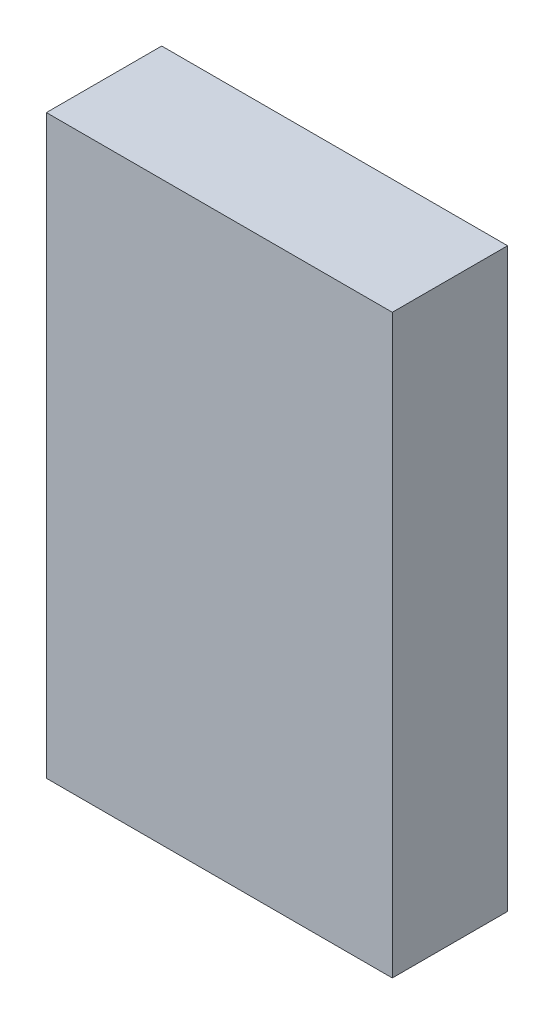
ISO-10303-21;
HEADER;
FILE_DESCRIPTION(('STEP AP214'),'2;1');
FILE_NAME('part.step','',(''),(''),'','','');
FILE_SCHEMA(('AUTOMOTIVE_DESIGN { 1 0 10303 214 1 1 1 1 }'));
ENDSEC;
DATA;
#1=APPLICATION_CONTEXT('core data for automotive mechanical design processes');
#2=APPLICATION_PROTOCOL_DEFINITION('international standard','automotive_design',2000,#1);
#3=PRODUCT_CONTEXT('',#1,'mechanical');
#4=PRODUCT('Part','Part','',(#3));
#5=PRODUCT_RELATED_PRODUCT_CATEGORY('part','',(#4));
#6=PRODUCT_DEFINITION_FORMATION('','',#4);
#7=PRODUCT_DEFINITION_CONTEXT('part definition',#1,'design');
#8=PRODUCT_DEFINITION('design','',#6,#7);
#9=PRODUCT_DEFINITION_SHAPE('','',#8);
#10=(LENGTH_UNIT() NAMED_UNIT(*) SI_UNIT(.MILLI.,.METRE.));
#11=(NAMED_UNIT(*) PLANE_ANGLE_UNIT() SI_UNIT($,.RADIAN.));
#12=(NAMED_UNIT(*) SI_UNIT($,.STERADIAN.) SOLID_ANGLE_UNIT());
#13=UNCERTAINTY_MEASURE_WITH_UNIT(LENGTH_MEASURE(1.E-05),#10,'distance_accuracy_value','');
#14=(GEOMETRIC_REPRESENTATION_CONTEXT(3) GLOBAL_UNCERTAINTY_ASSIGNED_CONTEXT((#13)) GLOBAL_UNIT_ASSIGNED_CONTEXT((#10,
#11,#12)) REPRESENTATION_CONTEXT('',''));
#15=CARTESIAN_POINT('',(0.,0.,0.));
#16=DIRECTION('',(0.,0.,1.));
#17=DIRECTION('',(1.,0.,0.));
#18=AXIS2_PLACEMENT_3D('',#15,#16,#17);
#19=CARTESIAN_POINT('',(1.5,-2.5,1.));
#20=DIRECTION('',(-1.,0.,0.));
#21=DIRECTION('',(0.,0.,1.));
#22=AXIS2_PLACEMENT_3D('',#19,#20,#21);
#23=PLANE('',#22);
#24=DIRECTION('',(0.,1.,0.));
#25=VECTOR('',#24,1.);
#26=CARTESIAN_POINT('',(1.5,-2.5,0.));
#27=LINE('',#26,#25);
#28=CARTESIAN_POINT('',(1.5,-2.5,0.));
#29=VERTEX_POINT('',#28);
#30=CARTESIAN_POINT('',(1.5,2.5,0.));
#31=VERTEX_POINT('',#30);
#32=EDGE_CURVE('E98',#29,#31,#27,.T.);
#33=ORIENTED_EDGE('',*,*,#32,.T.);
#34=DIRECTION('',(0.,0.,-1.));
#35=VECTOR('',#34,1.);
#36=CARTESIAN_POINT('',(1.5,2.5,1.));
#37=LINE('',#36,#35);
#38=CARTESIAN_POINT('',(1.5,2.5,1.));
#39=VERTEX_POINT('',#38);
#40=EDGE_CURVE('E11',#39,#31,#37,.T.);
#41=ORIENTED_EDGE('',*,*,#40,.F.);
#42=DIRECTION('',(0.,1.,0.));
#43=VECTOR('',#42,1.);
#44=CARTESIAN_POINT('',(1.5,-2.5,1.));
#45=LINE('',#44,#43);
#46=CARTESIAN_POINT('',(1.5,-2.5,1.));
#47=VERTEX_POINT('',#46);
#48=EDGE_CURVE('E86',#47,#39,#45,.T.);
#49=ORIENTED_EDGE('',*,*,#48,.F.);
#50=DIRECTION('',(0.,0.,-1.));
#51=VECTOR('',#50,1.);
#52=CARTESIAN_POINT('',(1.5,-2.5,1.));
#53=LINE('',#52,#51);
#54=EDGE_CURVE('E94',#47,#29,#53,.T.);
#55=ORIENTED_EDGE('',*,*,#54,.T.);
#56=EDGE_LOOP('',(#33,#41,#49,#55));
#57=FACE_BOUND('',#56,.T.);
#58=ADVANCED_FACE('F35',(#57),#23,.F.);
#59=CARTESIAN_POINT('',(-1.5,2.5,1.));
#60=DIRECTION('',(0.,-1.,0.));
#61=DIRECTION('',(0.,0.,-1.));
#62=AXIS2_PLACEMENT_3D('',#59,#60,#61);
#63=PLANE('',#62);
#64=DIRECTION('',(-1.,0.,0.));
#65=VECTOR('',#64,1.);
#66=CARTESIAN_POINT('',(-1.5,2.5,0.));
#67=LINE('',#66,#65);
#68=CARTESIAN_POINT('',(-1.5,2.5,0.));
#69=VERTEX_POINT('',#68);
#70=EDGE_CURVE('E90',#31,#69,#67,.T.);
#71=ORIENTED_EDGE('',*,*,#70,.T.);
#72=DIRECTION('',(0.,0.,-1.));
#73=VECTOR('',#72,1.);
#74=CARTESIAN_POINT('',(-1.5,2.5,1.));
#75=LINE('',#74,#73);
#76=CARTESIAN_POINT('',(-1.5,2.5,1.));
#77=VERTEX_POINT('',#76);
#78=EDGE_CURVE('E43',#77,#69,#75,.T.);
#79=ORIENTED_EDGE('',*,*,#78,.F.);
#80=DIRECTION('',(-1.,0.,0.));
#81=VECTOR('',#80,1.);
#82=CARTESIAN_POINT('',(-1.5,2.5,1.));
#83=LINE('',#82,#81);
#84=EDGE_CURVE('E81',#39,#77,#83,.T.);
#85=ORIENTED_EDGE('',*,*,#84,.F.);
#86=ORIENTED_EDGE('',*,*,#40,.T.);
#87=EDGE_LOOP('',(#71,#79,#85,#86));
#88=FACE_BOUND('',#87,.T.);
#89=ADVANCED_FACE('F89',(#88),#63,.F.);
#90=CARTESIAN_POINT('',(-1.5,-2.5,1.));
#91=DIRECTION('',(1.,0.,0.));
#92=DIRECTION('',(0.,0.,-1.));
#93=AXIS2_PLACEMENT_3D('',#90,#91,#92);
#94=PLANE('',#93);
#95=DIRECTION('',(0.,-1.,0.));
#96=VECTOR('',#95,1.);
#97=CARTESIAN_POINT('',(-1.5,-2.5,0.));
#98=LINE('',#97,#96);
#99=CARTESIAN_POINT('',(-1.5,-2.5,0.));
#100=VERTEX_POINT('',#99);
#101=EDGE_CURVE('E68',#69,#100,#98,.T.);
#102=ORIENTED_EDGE('',*,*,#101,.T.);
#103=DIRECTION('',(0.,0.,-1.));
#104=VECTOR('',#103,1.);
#105=CARTESIAN_POINT('',(-1.5,-2.5,1.));
#106=LINE('',#105,#104);
#107=CARTESIAN_POINT('',(-1.5,-2.5,1.));
#108=VERTEX_POINT('',#107);
#109=EDGE_CURVE('E91',#108,#100,#106,.T.);
#110=ORIENTED_EDGE('',*,*,#109,.F.);
#111=DIRECTION('',(0.,-1.,0.));
#112=VECTOR('',#111,1.);
#113=CARTESIAN_POINT('',(-1.5,-2.5,1.));
#114=LINE('',#113,#112);
#115=EDGE_CURVE('E84',#77,#108,#114,.T.);
#116=ORIENTED_EDGE('',*,*,#115,.F.);
#117=ORIENTED_EDGE('',*,*,#78,.T.);
#118=EDGE_LOOP('',(#102,#110,#116,#117));
#119=FACE_BOUND('',#118,.T.);
#120=ADVANCED_FACE('F92',(#119),#94,.F.);
#121=CARTESIAN_POINT('',(-1.5,-2.5,1.));
#122=DIRECTION('',(0.,1.,0.));
#123=DIRECTION('',(0.,0.,1.));
#124=AXIS2_PLACEMENT_3D('',#121,#122,#123);
#125=PLANE('',#124);
#126=DIRECTION('',(1.,0.,0.));
#127=VECTOR('',#126,1.);
#128=CARTESIAN_POINT('',(-1.5,-2.5,0.));
#129=LINE('',#128,#127);
#130=EDGE_CURVE('E74',#100,#29,#129,.T.);
#131=ORIENTED_EDGE('',*,*,#130,.T.);
#132=ORIENTED_EDGE('',*,*,#54,.F.);
#133=DIRECTION('',(1.,0.,0.));
#134=VECTOR('',#133,1.);
#135=CARTESIAN_POINT('',(-1.5,-2.5,1.));
#136=LINE('',#135,#134);
#137=EDGE_CURVE('E51',#108,#47,#136,.T.);
#138=ORIENTED_EDGE('',*,*,#137,.F.);
#139=ORIENTED_EDGE('',*,*,#109,.T.);
#140=EDGE_LOOP('',(#131,#132,#138,#139));
#141=FACE_BOUND('',#140,.T.);
#142=ADVANCED_FACE('F105',(#141),#125,.F.);
#143=CARTESIAN_POINT('',(0.,0.,1.));
#144=DIRECTION('',(0.,0.,-1.));
#145=DIRECTION('',(-1.,0.,0.));
#146=AXIS2_PLACEMENT_3D('',#143,#144,#145);
#147=PLANE('',#146);
#148=ORIENTED_EDGE('',*,*,#48,.T.);
#149=ORIENTED_EDGE('',*,*,#84,.T.);
#150=ORIENTED_EDGE('',*,*,#115,.T.);
#151=ORIENTED_EDGE('',*,*,#137,.T.);
#152=EDGE_LOOP('',(#148,#149,#150,#151));
#153=FACE_BOUND('',#152,.T.);
#154=ADVANCED_FACE('F82',(#153),#147,.F.);
#155=CARTESIAN_POINT('',(0.,0.,0.));
#156=DIRECTION('',(0.,0.,-1.));
#157=DIRECTION('',(-1.,0.,0.));
#158=AXIS2_PLACEMENT_3D('',#155,#156,#157);
#159=PLANE('',#158);
#160=ORIENTED_EDGE('',*,*,#32,.F.);
#161=ORIENTED_EDGE('',*,*,#130,.F.);
#162=ORIENTED_EDGE('',*,*,#101,.F.);
#163=ORIENTED_EDGE('',*,*,#70,.F.);
#164=EDGE_LOOP('',(#160,#161,#162,#163));
#165=FACE_BOUND('',#164,.T.);
#166=ADVANCED_FACE('F108',(#165),#159,.T.);
#167=CLOSED_SHELL('',(#58,#89,#120,#142,#154,#166));
#168=MANIFOLD_SOLID_BREP('B2',#167);
#169=ADVANCED_BREP_SHAPE_REPRESENTATION('',(#18,#168),#14);
#170=SHAPE_DEFINITION_REPRESENTATION(#9,#169);
ENDSEC;
END-ISO-10303-21;
